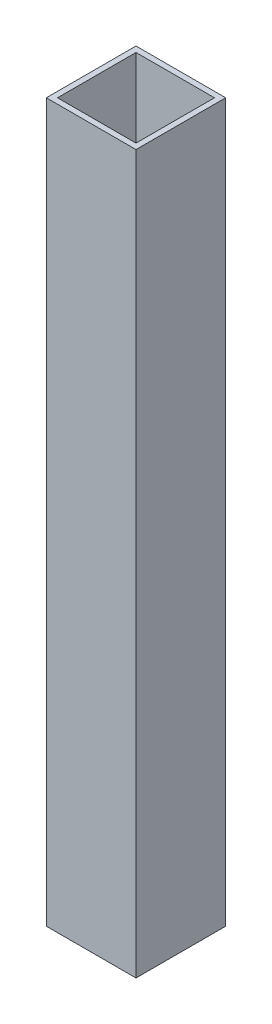
ISO-10303-21;
HEADER;
FILE_DESCRIPTION(('STEP AP214'),'2;1');
FILE_NAME('part.step','',(''),(''),'','','');
FILE_SCHEMA(('AUTOMOTIVE_DESIGN { 1 0 10303 214 1 1 1 1 }'));
ENDSEC;
DATA;
#1=APPLICATION_CONTEXT('core data for automotive mechanical design processes');
#2=APPLICATION_PROTOCOL_DEFINITION('international standard','automotive_design',2000,#1);
#3=PRODUCT_CONTEXT('',#1,'mechanical');
#4=PRODUCT('Part','Part','',(#3));
#5=PRODUCT_RELATED_PRODUCT_CATEGORY('part','',(#4));
#6=PRODUCT_DEFINITION_FORMATION('','',#4);
#7=PRODUCT_DEFINITION_CONTEXT('part definition',#1,'design');
#8=PRODUCT_DEFINITION('design','',#6,#7);
#9=PRODUCT_DEFINITION_SHAPE('','',#8);
#10=(LENGTH_UNIT() NAMED_UNIT(*) SI_UNIT(.MILLI.,.METRE.));
#11=(NAMED_UNIT(*) PLANE_ANGLE_UNIT() SI_UNIT($,.RADIAN.));
#12=(NAMED_UNIT(*) SI_UNIT($,.STERADIAN.) SOLID_ANGLE_UNIT());
#13=UNCERTAINTY_MEASURE_WITH_UNIT(LENGTH_MEASURE(1.E-05),#10,'distance_accuracy_value','');
#14=(GEOMETRIC_REPRESENTATION_CONTEXT(3) GLOBAL_UNCERTAINTY_ASSIGNED_CONTEXT((#13)) GLOBAL_UNIT_ASSIGNED_CONTEXT((#10,
#11,#12)) REPRESENTATION_CONTEXT('',''));
#15=CARTESIAN_POINT('',(0.,0.,0.));
#16=DIRECTION('',(0.,0.,1.));
#17=DIRECTION('',(1.,0.,0.));
#18=AXIS2_PLACEMENT_3D('',#15,#16,#17);
#19=CARTESIAN_POINT('',(0.,203.2,0.));
#20=DIRECTION('',(0.,-1.,0.));
#21=DIRECTION('',(0.,0.,-1.));
#22=AXIS2_PLACEMENT_3D('',#19,#20,#21);
#23=PLANE('',#22);
#24=DIRECTION('',(0.,0.,1.));
#25=VECTOR('',#24,1.);
#26=CARTESIAN_POINT('',(-12.7,203.2,-12.7));
#27=LINE('',#26,#25);
#28=CARTESIAN_POINT('',(-12.7,203.2,-12.7));
#29=VERTEX_POINT('',#28);
#30=CARTESIAN_POINT('',(-12.7,203.2,12.7));
#31=VERTEX_POINT('',#30);
#32=EDGE_CURVE('E133',#29,#31,#27,.T.);
#33=ORIENTED_EDGE('',*,*,#32,.T.);
#34=DIRECTION('',(1.,0.,0.));
#35=VECTOR('',#34,1.);
#36=CARTESIAN_POINT('',(12.7,203.2,12.7));
#37=LINE('',#36,#35);
#38=CARTESIAN_POINT('',(12.7,203.2,12.7));
#39=VERTEX_POINT('',#38);
#40=EDGE_CURVE('E136',#31,#39,#37,.T.);
#41=ORIENTED_EDGE('',*,*,#40,.T.);
#42=DIRECTION('',(0.,0.,-1.));
#43=VECTOR('',#42,1.);
#44=CARTESIAN_POINT('',(12.7,203.2,-12.7));
#45=LINE('',#44,#43);
#46=CARTESIAN_POINT('',(12.7,203.2,-12.7));
#47=VERTEX_POINT('',#46);
#48=EDGE_CURVE('E139',#39,#47,#45,.T.);
#49=ORIENTED_EDGE('',*,*,#48,.T.);
#50=DIRECTION('',(-1.,0.,0.));
#51=VECTOR('',#50,1.);
#52=CARTESIAN_POINT('',(12.7,203.2,-12.7));
#53=LINE('',#52,#51);
#54=EDGE_CURVE('E141',#47,#29,#53,.T.);
#55=ORIENTED_EDGE('',*,*,#54,.T.);
#56=EDGE_LOOP('',(#33,#41,#49,#55));
#57=FACE_BOUND('',#56,.T.);
#58=DIRECTION('',(0.,0.,1.));
#59=VECTOR('',#58,1.);
#60=CARTESIAN_POINT('',(-11.1125,203.2,-11.1125));
#61=LINE('',#60,#59);
#62=CARTESIAN_POINT('',(-11.1125,203.2,-11.1125));
#63=VERTEX_POINT('',#62);
#64=CARTESIAN_POINT('',(-11.1125,203.2,11.1125));
#65=VERTEX_POINT('',#64);
#66=EDGE_CURVE('E97',#63,#65,#61,.T.);
#67=ORIENTED_EDGE('',*,*,#66,.F.);
#68=DIRECTION('',(-1.,0.,0.));
#69=VECTOR('',#68,1.);
#70=CARTESIAN_POINT('',(11.1125,203.2,-11.1125));
#71=LINE('',#70,#69);
#72=CARTESIAN_POINT('',(11.1125,203.2,-11.1125));
#73=VERTEX_POINT('',#72);
#74=EDGE_CURVE('E119',#73,#63,#71,.T.);
#75=ORIENTED_EDGE('',*,*,#74,.F.);
#76=DIRECTION('',(0.,0.,-1.));
#77=VECTOR('',#76,1.);
#78=CARTESIAN_POINT('',(11.1125,203.2,-11.1125));
#79=LINE('',#78,#77);
#80=CARTESIAN_POINT('',(11.1125,203.2,11.1125));
#81=VERTEX_POINT('',#80);
#82=EDGE_CURVE('E117',#81,#73,#79,.T.);
#83=ORIENTED_EDGE('',*,*,#82,.F.);
#84=DIRECTION('',(1.,0.,0.));
#85=VECTOR('',#84,1.);
#86=CARTESIAN_POINT('',(11.1125,203.2,11.1125));
#87=LINE('',#86,#85);
#88=EDGE_CURVE('E105',#65,#81,#87,.T.);
#89=ORIENTED_EDGE('',*,*,#88,.F.);
#90=EDGE_LOOP('',(#67,#75,#83,#89));
#91=FACE_BOUND('',#90,.T.);
#92=ADVANCED_FACE('F32',(#57,#91),#23,.F.);
#93=CARTESIAN_POINT('',(0.,0.,0.));
#94=DIRECTION('',(0.,-1.,0.));
#95=DIRECTION('',(0.,0.,-1.));
#96=AXIS2_PLACEMENT_3D('',#93,#94,#95);
#97=PLANE('',#96);
#98=DIRECTION('',(0.,0.,1.));
#99=VECTOR('',#98,1.);
#100=CARTESIAN_POINT('',(-12.7,0.,-12.7));
#101=LINE('',#100,#99);
#102=CARTESIAN_POINT('',(-12.7,0.,-12.7));
#103=VERTEX_POINT('',#102);
#104=CARTESIAN_POINT('',(-12.7,0.,12.7));
#105=VERTEX_POINT('',#104);
#106=EDGE_CURVE('E113',#103,#105,#101,.T.);
#107=ORIENTED_EDGE('',*,*,#106,.F.);
#108=DIRECTION('',(-1.,0.,0.));
#109=VECTOR('',#108,1.);
#110=CARTESIAN_POINT('',(12.7,0.,-12.7));
#111=LINE('',#110,#109);
#112=CARTESIAN_POINT('',(12.7,0.,-12.7));
#113=VERTEX_POINT('',#112);
#114=EDGE_CURVE('E137',#113,#103,#111,.T.);
#115=ORIENTED_EDGE('',*,*,#114,.F.);
#116=DIRECTION('',(0.,0.,-1.));
#117=VECTOR('',#116,1.);
#118=CARTESIAN_POINT('',(12.7,0.,-12.7));
#119=LINE('',#118,#117);
#120=CARTESIAN_POINT('',(12.7,0.,12.7));
#121=VERTEX_POINT('',#120);
#122=EDGE_CURVE('E148',#121,#113,#119,.T.);
#123=ORIENTED_EDGE('',*,*,#122,.F.);
#124=DIRECTION('',(1.,0.,0.));
#125=VECTOR('',#124,1.);
#126=CARTESIAN_POINT('',(12.7,0.,12.7));
#127=LINE('',#126,#125);
#128=EDGE_CURVE('E146',#105,#121,#127,.T.);
#129=ORIENTED_EDGE('',*,*,#128,.F.);
#130=EDGE_LOOP('',(#107,#115,#123,#129));
#131=FACE_BOUND('',#130,.T.);
#132=DIRECTION('',(-1.,0.,0.));
#133=VECTOR('',#132,1.);
#134=CARTESIAN_POINT('',(11.1125,0.,-11.1125));
#135=LINE('',#134,#133);
#136=CARTESIAN_POINT('',(11.1125,0.,-11.1125));
#137=VERTEX_POINT('',#136);
#138=CARTESIAN_POINT('',(-11.1125,0.,-11.1125));
#139=VERTEX_POINT('',#138);
#140=EDGE_CURVE('E106',#137,#139,#135,.T.);
#141=ORIENTED_EDGE('',*,*,#140,.T.);
#142=DIRECTION('',(0.,0.,1.));
#143=VECTOR('',#142,1.);
#144=CARTESIAN_POINT('',(-11.1125,0.,-11.1125));
#145=LINE('',#144,#143);
#146=CARTESIAN_POINT('',(-11.1125,0.,11.1125));
#147=VERTEX_POINT('',#146);
#148=EDGE_CURVE('E55',#139,#147,#145,.T.);
#149=ORIENTED_EDGE('',*,*,#148,.T.);
#150=DIRECTION('',(1.,0.,0.));
#151=VECTOR('',#150,1.);
#152=CARTESIAN_POINT('',(11.1125,0.,11.1125));
#153=LINE('',#152,#151);
#154=CARTESIAN_POINT('',(11.1125,0.,11.1125));
#155=VERTEX_POINT('',#154);
#156=EDGE_CURVE('E112',#147,#155,#153,.T.);
#157=ORIENTED_EDGE('',*,*,#156,.T.);
#158=DIRECTION('',(0.,0.,-1.));
#159=VECTOR('',#158,1.);
#160=CARTESIAN_POINT('',(11.1125,0.,-11.1125));
#161=LINE('',#160,#159);
#162=EDGE_CURVE('E125',#155,#137,#161,.T.);
#163=ORIENTED_EDGE('',*,*,#162,.T.);
#164=EDGE_LOOP('',(#141,#149,#157,#163));
#165=FACE_BOUND('',#164,.T.);
#166=ADVANCED_FACE('F166',(#131,#165),#97,.T.);
#167=CARTESIAN_POINT('',(-12.7,203.2,-12.7));
#168=DIRECTION('',(1.,0.,0.));
#169=DIRECTION('',(0.,0.,-1.));
#170=AXIS2_PLACEMENT_3D('',#167,#168,#169);
#171=PLANE('',#170);
#172=ORIENTED_EDGE('',*,*,#106,.T.);
#173=DIRECTION('',(0.,-1.,0.));
#174=VECTOR('',#173,1.);
#175=CARTESIAN_POINT('',(-12.7,203.2,12.7));
#176=LINE('',#175,#174);
#177=EDGE_CURVE('E11',#31,#105,#176,.T.);
#178=ORIENTED_EDGE('',*,*,#177,.F.);
#179=ORIENTED_EDGE('',*,*,#32,.F.);
#180=DIRECTION('',(0.,-1.,0.));
#181=VECTOR('',#180,1.);
#182=CARTESIAN_POINT('',(-12.7,203.2,-12.7));
#183=LINE('',#182,#181);
#184=EDGE_CURVE('E143',#29,#103,#183,.T.);
#185=ORIENTED_EDGE('',*,*,#184,.T.);
#186=EDGE_LOOP('',(#172,#178,#179,#185));
#187=FACE_BOUND('',#186,.T.);
#188=ADVANCED_FACE('F34',(#187),#171,.F.);
#189=CARTESIAN_POINT('',(12.7,203.2,12.7));
#190=DIRECTION('',(0.,0.,-1.));
#191=DIRECTION('',(-1.,0.,0.));
#192=AXIS2_PLACEMENT_3D('',#189,#190,#191);
#193=PLANE('',#192);
#194=ORIENTED_EDGE('',*,*,#128,.T.);
#195=DIRECTION('',(0.,-1.,0.));
#196=VECTOR('',#195,1.);
#197=CARTESIAN_POINT('',(12.7,203.2,12.7));
#198=LINE('',#197,#196);
#199=EDGE_CURVE('E40',#39,#121,#198,.T.);
#200=ORIENTED_EDGE('',*,*,#199,.F.);
#201=ORIENTED_EDGE('',*,*,#40,.F.);
#202=ORIENTED_EDGE('',*,*,#177,.T.);
#203=EDGE_LOOP('',(#194,#200,#201,#202));
#204=FACE_BOUND('',#203,.T.);
#205=ADVANCED_FACE('F176',(#204),#193,.F.);
#206=CARTESIAN_POINT('',(12.7,203.2,-12.7));
#207=DIRECTION('',(-1.,0.,0.));
#208=DIRECTION('',(0.,0.,1.));
#209=AXIS2_PLACEMENT_3D('',#206,#207,#208);
#210=PLANE('',#209);
#211=ORIENTED_EDGE('',*,*,#122,.T.);
#212=DIRECTION('',(0.,-1.,0.));
#213=VECTOR('',#212,1.);
#214=CARTESIAN_POINT('',(12.7,203.2,-12.7));
#215=LINE('',#214,#213);
#216=EDGE_CURVE('E153',#47,#113,#215,.T.);
#217=ORIENTED_EDGE('',*,*,#216,.F.);
#218=ORIENTED_EDGE('',*,*,#48,.F.);
#219=ORIENTED_EDGE('',*,*,#199,.T.);
#220=EDGE_LOOP('',(#211,#217,#218,#219));
#221=FACE_BOUND('',#220,.T.);
#222=ADVANCED_FACE('F160',(#221),#210,.F.);
#223=CARTESIAN_POINT('',(12.7,203.2,-12.7));
#224=DIRECTION('',(0.,0.,1.));
#225=DIRECTION('',(1.,0.,0.));
#226=AXIS2_PLACEMENT_3D('',#223,#224,#225);
#227=PLANE('',#226);
#228=ORIENTED_EDGE('',*,*,#114,.T.);
#229=ORIENTED_EDGE('',*,*,#184,.F.);
#230=ORIENTED_EDGE('',*,*,#54,.F.);
#231=ORIENTED_EDGE('',*,*,#216,.T.);
#232=EDGE_LOOP('',(#228,#229,#230,#231));
#233=FACE_BOUND('',#232,.T.);
#234=ADVANCED_FACE('F170',(#233),#227,.F.);
#235=CARTESIAN_POINT('',(-11.1125,203.2,-11.1125));
#236=DIRECTION('',(1.,0.,0.));
#237=DIRECTION('',(0.,0.,-1.));
#238=AXIS2_PLACEMENT_3D('',#235,#236,#237);
#239=PLANE('',#238);
#240=ORIENTED_EDGE('',*,*,#148,.F.);
#241=DIRECTION('',(0.,-1.,0.));
#242=VECTOR('',#241,1.);
#243=CARTESIAN_POINT('',(-11.1125,203.2,-11.1125));
#244=LINE('',#243,#242);
#245=EDGE_CURVE('E101',#63,#139,#244,.T.);
#246=ORIENTED_EDGE('',*,*,#245,.F.);
#247=ORIENTED_EDGE('',*,*,#66,.T.);
#248=DIRECTION('',(0.,-1.,0.));
#249=VECTOR('',#248,1.);
#250=CARTESIAN_POINT('',(-11.1125,203.2,11.1125));
#251=LINE('',#250,#249);
#252=EDGE_CURVE('E100',#65,#147,#251,.T.);
#253=ORIENTED_EDGE('',*,*,#252,.T.);
#254=EDGE_LOOP('',(#240,#246,#247,#253));
#255=FACE_BOUND('',#254,.T.);
#256=ADVANCED_FACE('F99',(#255),#239,.T.);
#257=CARTESIAN_POINT('',(11.1125,203.2,11.1125));
#258=DIRECTION('',(0.,0.,-1.));
#259=DIRECTION('',(-1.,0.,0.));
#260=AXIS2_PLACEMENT_3D('',#257,#258,#259);
#261=PLANE('',#260);
#262=ORIENTED_EDGE('',*,*,#156,.F.);
#263=ORIENTED_EDGE('',*,*,#252,.F.);
#264=ORIENTED_EDGE('',*,*,#88,.T.);
#265=DIRECTION('',(0.,-1.,0.));
#266=VECTOR('',#265,1.);
#267=CARTESIAN_POINT('',(11.1125,203.2,11.1125));
#268=LINE('',#267,#266);
#269=EDGE_CURVE('E114',#81,#155,#268,.T.);
#270=ORIENTED_EDGE('',*,*,#269,.T.);
#271=EDGE_LOOP('',(#262,#263,#264,#270));
#272=FACE_BOUND('',#271,.T.);
#273=ADVANCED_FACE('F109',(#272),#261,.T.);
#274=CARTESIAN_POINT('',(11.1125,203.2,-11.1125));
#275=DIRECTION('',(-1.,0.,0.));
#276=DIRECTION('',(0.,0.,1.));
#277=AXIS2_PLACEMENT_3D('',#274,#275,#276);
#278=PLANE('',#277);
#279=ORIENTED_EDGE('',*,*,#162,.F.);
#280=ORIENTED_EDGE('',*,*,#269,.F.);
#281=ORIENTED_EDGE('',*,*,#82,.T.);
#282=DIRECTION('',(0.,-1.,0.));
#283=VECTOR('',#282,1.);
#284=CARTESIAN_POINT('',(11.1125,203.2,-11.1125));
#285=LINE('',#284,#283);
#286=EDGE_CURVE('E47',#73,#137,#285,.T.);
#287=ORIENTED_EDGE('',*,*,#286,.T.);
#288=EDGE_LOOP('',(#279,#280,#281,#287));
#289=FACE_BOUND('',#288,.T.);
#290=ADVANCED_FACE('F199',(#289),#278,.T.);
#291=CARTESIAN_POINT('',(11.1125,203.2,-11.1125));
#292=DIRECTION('',(0.,0.,1.));
#293=DIRECTION('',(1.,0.,0.));
#294=AXIS2_PLACEMENT_3D('',#291,#292,#293);
#295=PLANE('',#294);
#296=ORIENTED_EDGE('',*,*,#140,.F.);
#297=ORIENTED_EDGE('',*,*,#286,.F.);
#298=ORIENTED_EDGE('',*,*,#74,.T.);
#299=ORIENTED_EDGE('',*,*,#245,.T.);
#300=EDGE_LOOP('',(#296,#297,#298,#299));
#301=FACE_BOUND('',#300,.T.);
#302=ADVANCED_FACE('F203',(#301),#295,.T.);
#303=CLOSED_SHELL('',(#92,#166,#188,#205,#222,#234,#256,#273,#290,#302));
#304=MANIFOLD_SOLID_BREP('B2',#303);
#305=ADVANCED_BREP_SHAPE_REPRESENTATION('',(#18,#304),#14);
#306=SHAPE_DEFINITION_REPRESENTATION(#9,#305);
ENDSEC;
END-ISO-10303-21;
